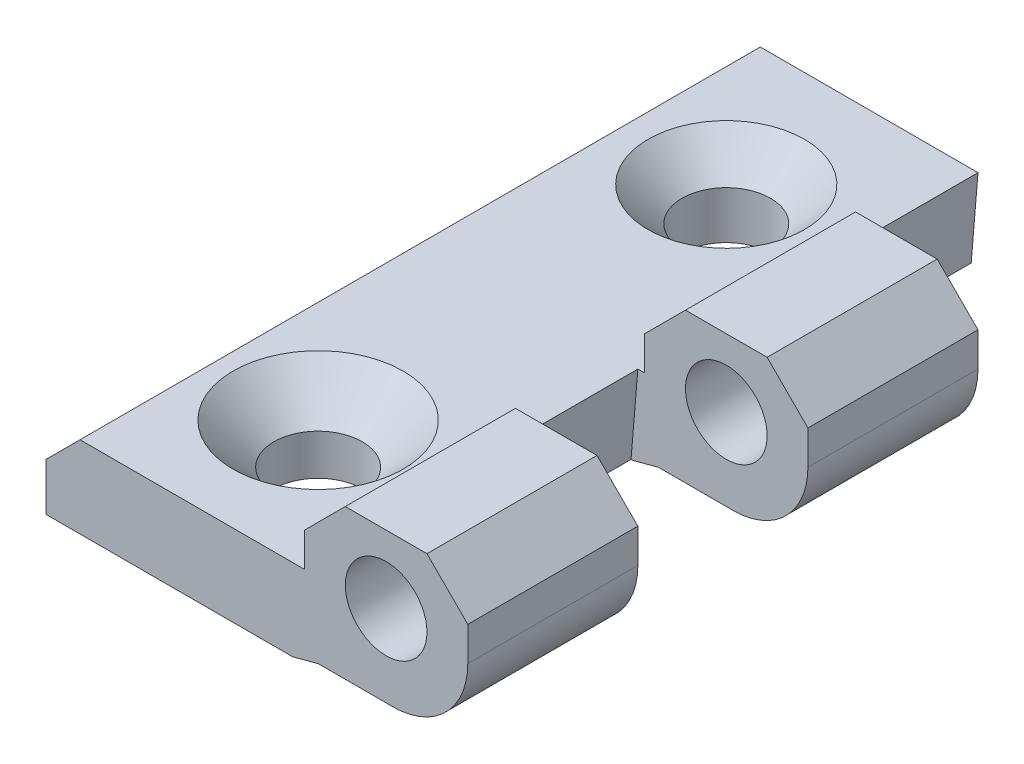
ISO-10303-21;
HEADER;
FILE_DESCRIPTION(('STEP AP214'),'2;1');
FILE_NAME('part.step','',(''),(''),'','','');
FILE_SCHEMA(('AUTOMOTIVE_DESIGN { 1 0 10303 214 1 1 1 1 }'));
ENDSEC;
DATA;
#1=APPLICATION_CONTEXT('core data for automotive mechanical design processes');
#2=APPLICATION_PROTOCOL_DEFINITION('international standard','automotive_design',2000,#1);
#3=PRODUCT_CONTEXT('',#1,'mechanical');
#4=PRODUCT('Part','Part','',(#3));
#5=PRODUCT_RELATED_PRODUCT_CATEGORY('part','',(#4));
#6=PRODUCT_DEFINITION_FORMATION('','',#4);
#7=PRODUCT_DEFINITION_CONTEXT('part definition',#1,'design');
#8=PRODUCT_DEFINITION('design','',#6,#7);
#9=PRODUCT_DEFINITION_SHAPE('','',#8);
#10=(LENGTH_UNIT() NAMED_UNIT(*) SI_UNIT(.MILLI.,.METRE.));
#11=(NAMED_UNIT(*) PLANE_ANGLE_UNIT() SI_UNIT($,.RADIAN.));
#12=(NAMED_UNIT(*) SI_UNIT($,.STERADIAN.) SOLID_ANGLE_UNIT());
#13=UNCERTAINTY_MEASURE_WITH_UNIT(LENGTH_MEASURE(1.E-05),#10,'distance_accuracy_value','');
#14=(GEOMETRIC_REPRESENTATION_CONTEXT(3) GLOBAL_UNCERTAINTY_ASSIGNED_CONTEXT((#13)) GLOBAL_UNIT_ASSIGNED_CONTEXT((#10,
#11,#12)) REPRESENTATION_CONTEXT('',''));
#15=CARTESIAN_POINT('',(0.,0.,0.));
#16=DIRECTION('',(0.,0.,1.));
#17=DIRECTION('',(1.,0.,0.));
#18=AXIS2_PLACEMENT_3D('',#15,#16,#17);
#19=CARTESIAN_POINT('',(-7.,0.,25.));
#20=DIRECTION('',(-0.99654575824488,0.0830454798537399,0.));
#21=DIRECTION('',(-0.0830454798537399,-0.99654575824488,0.));
#22=AXIS2_PLACEMENT_3D('',#19,#20,#21);
#23=PLANE('',#22);
#24=DIRECTION('',(0.08304547985374,0.99654575824488,0.));
#25=VECTOR('',#24,1.);
#26=CARTESIAN_POINT('',(-7.,0.,12.5));
#27=LINE('',#26,#25);
#28=CARTESIAN_POINT('',(-7.,0.,12.5));
#29=VERTEX_POINT('',#28);
#30=CARTESIAN_POINT('',(-6.5,6.,12.5));
#31=VERTEX_POINT('',#30);
#32=EDGE_CURVE('E199',#29,#31,#27,.T.);
#33=ORIENTED_EDGE('',*,*,#32,.F.);
#34=DIRECTION('',(0.,0.,-1.));
#35=VECTOR('',#34,1.);
#36=CARTESIAN_POINT('',(-7.,0.,12.5));
#37=LINE('',#36,#35);
#38=CARTESIAN_POINT('',(-7.,0.,0.));
#39=VERTEX_POINT('',#38);
#40=EDGE_CURVE('E187',#29,#39,#37,.T.);
#41=ORIENTED_EDGE('',*,*,#40,.T.);
#42=DIRECTION('',(0.08304547985374,0.99654575824488,0.));
#43=VECTOR('',#42,1.);
#44=CARTESIAN_POINT('',(-7.,0.,0.));
#45=LINE('',#44,#43);
#46=CARTESIAN_POINT('',(-6.5,6.,0.));
#47=VERTEX_POINT('',#46);
#48=EDGE_CURVE('E198',#39,#47,#45,.T.);
#49=ORIENTED_EDGE('',*,*,#48,.T.);
#50=DIRECTION('',(0.,0.,-1.));
#51=VECTOR('',#50,1.);
#52=CARTESIAN_POINT('',(-6.5,6.,12.5));
#53=LINE('',#52,#51);
#54=EDGE_CURVE('E212',#31,#47,#53,.T.);
#55=ORIENTED_EDGE('',*,*,#54,.F.);
#56=EDGE_LOOP('',(#33,#41,#49,#55));
#57=FACE_BOUND('',#56,.T.);
#58=ADVANCED_FACE('F16',(#57),#23,.F.);
#59=CARTESIAN_POINT('',(0.499999999999962,6.,12.5));
#60=DIRECTION('',(0.,0.,1.));
#61=DIRECTION('',(1.,0.,0.));
#62=AXIS2_PLACEMENT_3D('',#59,#60,#61);
#63=PLANE('',#62);
#64=CARTESIAN_POINT('',(0.,6.5,12.5));
#65=DIRECTION('',(0.,0.,1.));
#66=DIRECTION('',(1.,0.,0.));
#67=AXIS2_PLACEMENT_3D('',#64,#65,#66);
#68=CIRCLE('',#67,3.);
#69=CARTESIAN_POINT('',(3.,6.5,12.5));
#70=VERTEX_POINT('',#69);
#71=EDGE_CURVE('E209',#70,#70,#68,.T.);
#72=ORIENTED_EDGE('',*,*,#71,.T.);
#73=EDGE_LOOP('',(#72));
#74=FACE_BOUND('',#73,.T.);
#75=DIRECTION('',(1.,0.,0.));
#76=VECTOR('',#75,1.);
#77=CARTESIAN_POINT('',(-7.,0.,12.5));
#78=LINE('',#77,#76);
#79=CARTESIAN_POINT('',(-6.8660254037844,0.,12.5));
#80=VERTEX_POINT('',#79);
#81=EDGE_CURVE('E191',#29,#80,#78,.T.);
#82=ORIENTED_EDGE('',*,*,#81,.F.);
#83=ORIENTED_EDGE('',*,*,#32,.T.);
#84=DIRECTION('',(-1.,0.,0.));
#85=VECTOR('',#84,1.);
#86=CARTESIAN_POINT('',(-6.,6.,12.5));
#87=LINE('',#86,#85);
#88=CARTESIAN_POINT('',(-6.,6.,12.5));
#89=VERTEX_POINT('',#88);
#90=EDGE_CURVE('E208',#89,#31,#87,.T.);
#91=ORIENTED_EDGE('',*,*,#90,.F.);
#92=DIRECTION('',(0.,-1.,0.));
#93=VECTOR('',#92,1.);
#94=CARTESIAN_POINT('',(-6.,8.5,12.5));
#95=LINE('',#94,#93);
#96=CARTESIAN_POINT('',(-6.,8.5,12.5));
#97=VERTEX_POINT('',#96);
#98=EDGE_CURVE('E230',#97,#89,#95,.T.);
#99=ORIENTED_EDGE('',*,*,#98,.F.);
#100=DIRECTION('',(-0.707106781186548,-0.707106781186547,0.));
#101=VECTOR('',#100,1.);
#102=CARTESIAN_POINT('',(-3.,11.5,12.5));
#103=LINE('',#102,#101);
#104=CARTESIAN_POINT('',(-3.,11.5,12.5));
#105=VERTEX_POINT('',#104);
#106=EDGE_CURVE('E234',#105,#97,#103,.T.);
#107=ORIENTED_EDGE('',*,*,#106,.F.);
#108=DIRECTION('',(-1.,0.,0.));
#109=VECTOR('',#108,1.);
#110=CARTESIAN_POINT('',(3.,11.5,12.5));
#111=LINE('',#110,#109);
#112=CARTESIAN_POINT('',(3.,11.5,12.5));
#113=VERTEX_POINT('',#112);
#114=EDGE_CURVE('E238',#113,#105,#111,.T.);
#115=ORIENTED_EDGE('',*,*,#114,.F.);
#116=DIRECTION('',(-0.707106781186548,0.707106781186547,0.));
#117=VECTOR('',#116,1.);
#118=CARTESIAN_POINT('',(6.,8.5,12.5));
#119=LINE('',#118,#117);
#120=CARTESIAN_POINT('',(6.,8.5,12.5));
#121=VERTEX_POINT('',#120);
#122=EDGE_CURVE('E242',#121,#113,#119,.T.);
#123=ORIENTED_EDGE('',*,*,#122,.F.);
#124=DIRECTION('',(0.,1.,0.));
#125=VECTOR('',#124,1.);
#126=CARTESIAN_POINT('',(6.,6.,12.5));
#127=LINE('',#126,#125);
#128=CARTESIAN_POINT('',(6.,6.,12.5));
#129=VERTEX_POINT('',#128);
#130=EDGE_CURVE('E246',#129,#121,#127,.T.);
#131=ORIENTED_EDGE('',*,*,#130,.F.);
#132=CARTESIAN_POINT('',(0.499999999999962,6.,12.5));
#133=DIRECTION('',(0.,0.,1.));
#134=DIRECTION('',(0.,-1.,0.));
#135=AXIS2_PLACEMENT_3D('',#132,#133,#134);
#136=CIRCLE('',#135,5.5);
#137=CARTESIAN_POINT('',(0.5,0.5,12.5));
#138=VERTEX_POINT('',#137);
#139=EDGE_CURVE('E250',#138,#129,#136,.T.);
#140=ORIENTED_EDGE('',*,*,#139,.F.);
#141=DIRECTION('',(1.,0.,0.));
#142=VECTOR('',#141,1.);
#143=CARTESIAN_POINT('',(-5.,0.5,12.5));
#144=LINE('',#143,#142);
#145=CARTESIAN_POINT('',(-5.,0.5,12.5));
#146=VERTEX_POINT('',#145);
#147=EDGE_CURVE('E254',#146,#138,#144,.T.);
#148=ORIENTED_EDGE('',*,*,#147,.F.);
#149=DIRECTION('',(0.965925826289067,0.258819045102526,0.));
#150=VECTOR('',#149,1.);
#151=CARTESIAN_POINT('',(-6.8660254037844,0.,12.5));
#152=LINE('',#151,#150);
#153=EDGE_CURVE('E207',#80,#146,#152,.T.);
#154=ORIENTED_EDGE('',*,*,#153,.F.);
#155=EDGE_LOOP('',(#82,#83,#91,#99,#107,#115,#123,#131,#140,#148,#154));
#156=FACE_BOUND('',#155,.T.);
#157=ADVANCED_FACE('F204',(#74,#156),#63,.F.);
#158=CARTESIAN_POINT('',(-25.,0.,25.));
#159=DIRECTION('',(0.,1.,0.));
#160=DIRECTION('',(0.,0.,1.));
#161=AXIS2_PLACEMENT_3D('',#158,#159,#160);
#162=PLANE('',#161);
#163=CARTESIAN_POINT('',(-15.,0.,-15.));
#164=DIRECTION('',(0.,-1.,0.));
#165=DIRECTION('',(0.,0.,-1.));
#166=AXIS2_PLACEMENT_3D('',#163,#164,#165);
#167=CIRCLE('',#166,3.25);
#168=CARTESIAN_POINT('',(-15.,0.,-18.25));
#169=VERTEX_POINT('',#168);
#170=EDGE_CURVE('E261',#169,#169,#167,.T.);
#171=ORIENTED_EDGE('',*,*,#170,.F.);
#172=EDGE_LOOP('',(#171));
#173=FACE_BOUND('',#172,.T.);
#174=CARTESIAN_POINT('',(-15.,0.,15.));
#175=DIRECTION('',(0.,-1.,0.));
#176=DIRECTION('',(0.,0.,-1.));
#177=AXIS2_PLACEMENT_3D('',#174,#175,#176);
#178=CIRCLE('',#177,3.25);
#179=CARTESIAN_POINT('',(-15.,0.,11.75));
#180=VERTEX_POINT('',#179);
#181=EDGE_CURVE('E266',#180,#180,#178,.T.);
#182=ORIENTED_EDGE('',*,*,#181,.F.);
#183=EDGE_LOOP('',(#182));
#184=FACE_BOUND('',#183,.T.);
#185=DIRECTION('',(0.,0.,-1.));
#186=VECTOR('',#185,1.);
#187=CARTESIAN_POINT('',(-6.8660254037844,0.,25.));
#188=LINE('',#187,#186);
#189=CARTESIAN_POINT('',(-6.8660254037844,0.,25.));
#190=VERTEX_POINT('',#189);
#191=EDGE_CURVE('E269',#190,#80,#188,.T.);
#192=ORIENTED_EDGE('',*,*,#191,.F.);
#193=DIRECTION('',(1.,0.,0.));
#194=VECTOR('',#193,1.);
#195=CARTESIAN_POINT('',(-25.,0.,25.));
#196=LINE('',#195,#194);
#197=CARTESIAN_POINT('',(-25.,0.,25.));
#198=VERTEX_POINT('',#197);
#199=EDGE_CURVE('E271',#198,#190,#196,.T.);
#200=ORIENTED_EDGE('',*,*,#199,.F.);
#201=DIRECTION('',(0.,0.,-1.));
#202=VECTOR('',#201,1.);
#203=CARTESIAN_POINT('',(-25.,0.,25.));
#204=LINE('',#203,#202);
#205=CARTESIAN_POINT('',(-25.,0.,-25.));
#206=VERTEX_POINT('',#205);
#207=EDGE_CURVE('E275',#198,#206,#204,.T.);
#208=ORIENTED_EDGE('',*,*,#207,.T.);
#209=DIRECTION('',(1.,0.,0.));
#210=VECTOR('',#209,1.);
#211=CARTESIAN_POINT('',(-25.,0.,-25.));
#212=LINE('',#211,#210);
#213=CARTESIAN_POINT('',(-7.,0.,-25.));
#214=VERTEX_POINT('',#213);
#215=EDGE_CURVE('E280',#206,#214,#212,.T.);
#216=ORIENTED_EDGE('',*,*,#215,.T.);
#217=DIRECTION('',(0.,0.,-1.));
#218=VECTOR('',#217,1.);
#219=CARTESIAN_POINT('',(-7.,0.,-12.5));
#220=LINE('',#219,#218);
#221=CARTESIAN_POINT('',(-7.,0.,-12.5));
#222=VERTEX_POINT('',#221);
#223=EDGE_CURVE('E285',#222,#214,#220,.T.);
#224=ORIENTED_EDGE('',*,*,#223,.F.);
#225=DIRECTION('',(1.,0.,0.));
#226=VECTOR('',#225,1.);
#227=CARTESIAN_POINT('',(-7.,0.,-12.5));
#228=LINE('',#227,#226);
#229=CARTESIAN_POINT('',(-6.8660254037844,0.,-12.5));
#230=VERTEX_POINT('',#229);
#231=EDGE_CURVE('E289',#222,#230,#228,.T.);
#232=ORIENTED_EDGE('',*,*,#231,.T.);
#233=DIRECTION('',(0.,0.,1.));
#234=VECTOR('',#233,1.);
#235=CARTESIAN_POINT('',(-6.8660254037844,0.,-12.5));
#236=LINE('',#235,#234);
#237=CARTESIAN_POINT('',(-6.8660254037844,0.,0.));
#238=VERTEX_POINT('',#237);
#239=EDGE_CURVE('E294',#230,#238,#236,.T.);
#240=ORIENTED_EDGE('',*,*,#239,.T.);
#241=DIRECTION('',(1.,0.,0.));
#242=VECTOR('',#241,1.);
#243=CARTESIAN_POINT('',(-7.,0.,0.));
#244=LINE('',#243,#242);
#245=EDGE_CURVE('E194',#39,#238,#244,.T.);
#246=ORIENTED_EDGE('',*,*,#245,.F.);
#247=ORIENTED_EDGE('',*,*,#40,.F.);
#248=ORIENTED_EDGE('',*,*,#81,.T.);
#249=EDGE_LOOP('',(#192,#200,#208,#216,#224,#232,#240,#246,#247,#248));
#250=FACE_BOUND('',#249,.T.);
#251=ADVANCED_FACE('F190',(#173,#184,#250),#162,.F.);
#252=CARTESIAN_POINT('',(0.499999999999962,6.,0.));
#253=DIRECTION('',(0.,0.,1.));
#254=DIRECTION('',(1.,0.,0.));
#255=AXIS2_PLACEMENT_3D('',#252,#253,#254);
#256=PLANE('',#255);
#257=CARTESIAN_POINT('',(0.,6.5,0.));
#258=DIRECTION('',(0.,0.,1.));
#259=DIRECTION('',(1.,0.,0.));
#260=AXIS2_PLACEMENT_3D('',#257,#258,#259);
#261=CIRCLE('',#260,3.);
#262=CARTESIAN_POINT('',(3.,6.5,0.));
#263=VERTEX_POINT('',#262);
#264=EDGE_CURVE('E301',#263,#263,#261,.T.);
#265=ORIENTED_EDGE('',*,*,#264,.F.);
#266=EDGE_LOOP('',(#265));
#267=FACE_BOUND('',#266,.T.);
#268=ORIENTED_EDGE('',*,*,#48,.F.);
#269=ORIENTED_EDGE('',*,*,#245,.T.);
#270=DIRECTION('',(0.965925826289067,0.258819045102526,0.));
#271=VECTOR('',#270,1.);
#272=CARTESIAN_POINT('',(-6.8660254037844,0.,0.));
#273=LINE('',#272,#271);
#274=CARTESIAN_POINT('',(-5.,0.5,0.));
#275=VERTEX_POINT('',#274);
#276=EDGE_CURVE('E306',#238,#275,#273,.T.);
#277=ORIENTED_EDGE('',*,*,#276,.T.);
#278=DIRECTION('',(1.,0.,0.));
#279=VECTOR('',#278,1.);
#280=CARTESIAN_POINT('',(-5.,0.5,0.));
#281=LINE('',#280,#279);
#282=CARTESIAN_POINT('',(0.5,0.5,0.));
#283=VERTEX_POINT('',#282);
#284=EDGE_CURVE('E309',#275,#283,#281,.T.);
#285=ORIENTED_EDGE('',*,*,#284,.T.);
#286=CARTESIAN_POINT('',(0.499999999999962,6.,0.));
#287=DIRECTION('',(0.,0.,1.));
#288=DIRECTION('',(0.,-1.,0.));
#289=AXIS2_PLACEMENT_3D('',#286,#287,#288);
#290=CIRCLE('',#289,5.5);
#291=CARTESIAN_POINT('',(6.,6.,0.));
#292=VERTEX_POINT('',#291);
#293=EDGE_CURVE('E314',#283,#292,#290,.T.);
#294=ORIENTED_EDGE('',*,*,#293,.T.);
#295=DIRECTION('',(0.,1.,0.));
#296=VECTOR('',#295,1.);
#297=CARTESIAN_POINT('',(6.,6.,0.));
#298=LINE('',#297,#296);
#299=CARTESIAN_POINT('',(6.,8.5,0.));
#300=VERTEX_POINT('',#299);
#301=EDGE_CURVE('E319',#292,#300,#298,.T.);
#302=ORIENTED_EDGE('',*,*,#301,.T.);
#303=DIRECTION('',(-0.707106781186548,0.707106781186547,0.));
#304=VECTOR('',#303,1.);
#305=CARTESIAN_POINT('',(6.,8.5,0.));
#306=LINE('',#305,#304);
#307=CARTESIAN_POINT('',(3.,11.5,0.));
#308=VERTEX_POINT('',#307);
#309=EDGE_CURVE('E324',#300,#308,#306,.T.);
#310=ORIENTED_EDGE('',*,*,#309,.T.);
#311=DIRECTION('',(-1.,0.,0.));
#312=VECTOR('',#311,1.);
#313=CARTESIAN_POINT('',(3.,11.5,0.));
#314=LINE('',#313,#312);
#315=CARTESIAN_POINT('',(-3.,11.5,0.));
#316=VERTEX_POINT('',#315);
#317=EDGE_CURVE('E329',#308,#316,#314,.T.);
#318=ORIENTED_EDGE('',*,*,#317,.T.);
#319=DIRECTION('',(-0.707106781186548,-0.707106781186547,0.));
#320=VECTOR('',#319,1.);
#321=CARTESIAN_POINT('',(-3.,11.5,0.));
#322=LINE('',#321,#320);
#323=CARTESIAN_POINT('',(-6.,8.5,0.));
#324=VERTEX_POINT('',#323);
#325=EDGE_CURVE('E334',#316,#324,#322,.T.);
#326=ORIENTED_EDGE('',*,*,#325,.T.);
#327=DIRECTION('',(0.,-1.,0.));
#328=VECTOR('',#327,1.);
#329=CARTESIAN_POINT('',(-6.,8.5,0.));
#330=LINE('',#329,#328);
#331=CARTESIAN_POINT('',(-6.,6.,0.));
#332=VERTEX_POINT('',#331);
#333=EDGE_CURVE('E339',#324,#332,#330,.T.);
#334=ORIENTED_EDGE('',*,*,#333,.T.);
#335=DIRECTION('',(-1.,0.,0.));
#336=VECTOR('',#335,1.);
#337=CARTESIAN_POINT('',(-6.,6.,0.));
#338=LINE('',#337,#336);
#339=EDGE_CURVE('E344',#332,#47,#338,.T.);
#340=ORIENTED_EDGE('',*,*,#339,.T.);
#341=EDGE_LOOP('',(#268,#269,#277,#285,#294,#302,#310,#318,#326,#334,#340));
#342=FACE_BOUND('',#341,.T.);
#343=ADVANCED_FACE('F568',(#267,#342),#256,.T.);
#344=CARTESIAN_POINT('',(-6.5,6.,25.));
#345=DIRECTION('',(0.,-1.,0.));
#346=DIRECTION('',(0.,0.,-1.));
#347=AXIS2_PLACEMENT_3D('',#344,#345,#346);
#348=PLANE('',#347);
#349=CARTESIAN_POINT('',(-15.,6.,-15.));
#350=DIRECTION('',(0.,1.,0.));
#351=DIRECTION('',(0.,0.,-1.));
#352=AXIS2_PLACEMENT_3D('',#349,#350,#351);
#353=CIRCLE('',#352,5.75);
#354=CARTESIAN_POINT('',(-15.,6.,-20.75));
#355=VERTEX_POINT('',#354);
#356=EDGE_CURVE('E349',#355,#355,#353,.T.);
#357=ORIENTED_EDGE('',*,*,#356,.F.);
#358=EDGE_LOOP('',(#357));
#359=FACE_BOUND('',#358,.T.);
#360=CARTESIAN_POINT('',(-15.,6.,15.));
#361=DIRECTION('',(0.,-1.,0.));
#362=DIRECTION('',(0.,0.,-1.));
#363=AXIS2_PLACEMENT_3D('',#360,#361,#362);
#364=CIRCLE('',#363,6.25);
#365=CARTESIAN_POINT('',(-15.,6.,8.75));
#366=VERTEX_POINT('',#365);
#367=EDGE_CURVE('E354',#366,#366,#364,.T.);
#368=ORIENTED_EDGE('',*,*,#367,.T.);
#369=EDGE_LOOP('',(#368));
#370=FACE_BOUND('',#369,.T.);
#371=DIRECTION('',(0.,0.,-1.));
#372=VECTOR('',#371,1.);
#373=CARTESIAN_POINT('',(-22.5,6.,25.));
#374=LINE('',#373,#372);
#375=CARTESIAN_POINT('',(-22.5,6.,25.));
#376=VERTEX_POINT('',#375);
#377=CARTESIAN_POINT('',(-22.5,6.,-25.));
#378=VERTEX_POINT('',#377);
#379=EDGE_CURVE('E357',#376,#378,#374,.T.);
#380=ORIENTED_EDGE('',*,*,#379,.F.);
#381=DIRECTION('',(-1.,0.,0.));
#382=VECTOR('',#381,1.);
#383=CARTESIAN_POINT('',(-6.,6.,25.));
#384=LINE('',#383,#382);
#385=CARTESIAN_POINT('',(-6.,6.,25.));
#386=VERTEX_POINT('',#385);
#387=EDGE_CURVE('E359',#386,#376,#384,.T.);
#388=ORIENTED_EDGE('',*,*,#387,.F.);
#389=DIRECTION('',(0.,0.,-1.));
#390=VECTOR('',#389,1.);
#391=CARTESIAN_POINT('',(-6.,6.,25.));
#392=LINE('',#391,#390);
#393=EDGE_CURVE('E364',#386,#89,#392,.T.);
#394=ORIENTED_EDGE('',*,*,#393,.T.);
#395=ORIENTED_EDGE('',*,*,#90,.T.);
#396=ORIENTED_EDGE('',*,*,#54,.T.);
#397=ORIENTED_EDGE('',*,*,#339,.F.);
#398=DIRECTION('',(0.,0.,1.));
#399=VECTOR('',#398,1.);
#400=CARTESIAN_POINT('',(-6.,6.,-12.5));
#401=LINE('',#400,#399);
#402=CARTESIAN_POINT('',(-6.,6.,-12.5));
#403=VERTEX_POINT('',#402);
#404=EDGE_CURVE('E369',#403,#332,#401,.T.);
#405=ORIENTED_EDGE('',*,*,#404,.F.);
#406=DIRECTION('',(-1.,0.,0.));
#407=VECTOR('',#406,1.);
#408=CARTESIAN_POINT('',(-6.,6.,-12.5));
#409=LINE('',#408,#407);
#410=CARTESIAN_POINT('',(-6.5,6.,-12.5));
#411=VERTEX_POINT('',#410);
#412=EDGE_CURVE('E373',#403,#411,#409,.T.);
#413=ORIENTED_EDGE('',*,*,#412,.T.);
#414=DIRECTION('',(0.,0.,-1.));
#415=VECTOR('',#414,1.);
#416=CARTESIAN_POINT('',(-6.5,6.,-12.5));
#417=LINE('',#416,#415);
#418=CARTESIAN_POINT('',(-6.5,6.,-25.));
#419=VERTEX_POINT('',#418);
#420=EDGE_CURVE('E378',#411,#419,#417,.T.);
#421=ORIENTED_EDGE('',*,*,#420,.T.);
#422=DIRECTION('',(-1.,0.,0.));
#423=VECTOR('',#422,1.);
#424=CARTESIAN_POINT('',(-6.5,6.,-25.));
#425=LINE('',#424,#423);
#426=EDGE_CURVE('E383',#419,#378,#425,.T.);
#427=ORIENTED_EDGE('',*,*,#426,.T.);
#428=EDGE_LOOP('',(#380,#388,#394,#395,#396,#397,#405,#413,#421,#427));
#429=FACE_BOUND('',#428,.T.);
#430=ADVANCED_FACE('F595',(#359,#370,#429),#348,.F.);
#431=CARTESIAN_POINT('',(0.,6.5,25.));
#432=DIRECTION('',(0.,0.,-1.));
#433=DIRECTION('',(-1.,0.,0.));
#434=AXIS2_PLACEMENT_3D('',#431,#432,#433);
#435=CYLINDRICAL_SURFACE('',#434,3.);
#436=CARTESIAN_POINT('',(0.,6.5,25.));
#437=DIRECTION('',(0.,0.,1.));
#438=DIRECTION('',(1.,0.,0.));
#439=AXIS2_PLACEMENT_3D('',#436,#437,#438);
#440=CIRCLE('',#439,3.);
#441=CARTESIAN_POINT('',(3.,6.5,25.));
#442=VERTEX_POINT('',#441);
#443=EDGE_CURVE('E388',#442,#442,#440,.T.);
#444=ORIENTED_EDGE('',*,*,#443,.T.);
#445=EDGE_LOOP('',(#444));
#446=FACE_BOUND('',#445,.T.);
#447=ORIENTED_EDGE('',*,*,#71,.F.);
#448=EDGE_LOOP('',(#447));
#449=FACE_BOUND('',#448,.T.);
#450=ADVANCED_FACE('F709',(#446,#449),#435,.F.);
#451=CARTESIAN_POINT('',(-6.,8.5,25.));
#452=DIRECTION('',(1.,0.,0.));
#453=DIRECTION('',(0.,0.,-1.));
#454=AXIS2_PLACEMENT_3D('',#451,#452,#453);
#455=PLANE('',#454);
#456=ORIENTED_EDGE('',*,*,#98,.T.);
#457=ORIENTED_EDGE('',*,*,#393,.F.);
#458=DIRECTION('',(0.,-1.,0.));
#459=VECTOR('',#458,1.);
#460=CARTESIAN_POINT('',(-6.,8.5,25.));
#461=LINE('',#460,#459);
#462=CARTESIAN_POINT('',(-6.,8.5,25.));
#463=VERTEX_POINT('',#462);
#464=EDGE_CURVE('E393',#463,#386,#461,.T.);
#465=ORIENTED_EDGE('',*,*,#464,.F.);
#466=DIRECTION('',(0.,0.,-1.));
#467=VECTOR('',#466,1.);
#468=CARTESIAN_POINT('',(-6.,8.5,25.));
#469=LINE('',#468,#467);
#470=EDGE_CURVE('E395',#463,#97,#469,.T.);
#471=ORIENTED_EDGE('',*,*,#470,.T.);
#472=EDGE_LOOP('',(#456,#457,#465,#471));
#473=FACE_BOUND('',#472,.T.);
#474=ADVANCED_FACE('F609',(#473),#455,.F.);
#475=CARTESIAN_POINT('',(-3.,11.5,25.));
#476=DIRECTION('',(0.707106781186547,-0.707106781186548,0.));
#477=DIRECTION('',(0.707106781186548,0.707106781186547,0.));
#478=AXIS2_PLACEMENT_3D('',#475,#476,#477);
#479=PLANE('',#478);
#480=ORIENTED_EDGE('',*,*,#106,.T.);
#481=ORIENTED_EDGE('',*,*,#470,.F.);
#482=DIRECTION('',(-0.707106781186548,-0.707106781186547,0.));
#483=VECTOR('',#482,1.);
#484=CARTESIAN_POINT('',(-3.,11.5,25.));
#485=LINE('',#484,#483);
#486=CARTESIAN_POINT('',(-3.,11.5,25.));
#487=VERTEX_POINT('',#486);
#488=EDGE_CURVE('E400',#487,#463,#485,.T.);
#489=ORIENTED_EDGE('',*,*,#488,.F.);
#490=DIRECTION('',(0.,0.,-1.));
#491=VECTOR('',#490,1.);
#492=CARTESIAN_POINT('',(-3.,11.5,25.));
#493=LINE('',#492,#491);
#494=EDGE_CURVE('E404',#487,#105,#493,.T.);
#495=ORIENTED_EDGE('',*,*,#494,.T.);
#496=EDGE_LOOP('',(#480,#481,#489,#495));
#497=FACE_BOUND('',#496,.T.);
#498=ADVANCED_FACE('F614',(#497),#479,.F.);
#499=CARTESIAN_POINT('',(3.,11.5,25.));
#500=DIRECTION('',(0.,-1.,0.));
#501=DIRECTION('',(0.,0.,-1.));
#502=AXIS2_PLACEMENT_3D('',#499,#500,#501);
#503=PLANE('',#502);
#504=ORIENTED_EDGE('',*,*,#114,.T.);
#505=ORIENTED_EDGE('',*,*,#494,.F.);
#506=DIRECTION('',(-1.,0.,0.));
#507=VECTOR('',#506,1.);
#508=CARTESIAN_POINT('',(3.,11.5,25.));
#509=LINE('',#508,#507);
#510=CARTESIAN_POINT('',(3.,11.5,25.));
#511=VERTEX_POINT('',#510);
#512=EDGE_CURVE('E409',#511,#487,#509,.T.);
#513=ORIENTED_EDGE('',*,*,#512,.F.);
#514=DIRECTION('',(0.,0.,-1.));
#515=VECTOR('',#514,1.);
#516=CARTESIAN_POINT('',(3.,11.5,25.));
#517=LINE('',#516,#515);
#518=EDGE_CURVE('E413',#511,#113,#517,.T.);
#519=ORIENTED_EDGE('',*,*,#518,.T.);
#520=EDGE_LOOP('',(#504,#505,#513,#519));
#521=FACE_BOUND('',#520,.T.);
#522=ADVANCED_FACE('F618',(#521),#503,.F.);
#523=CARTESIAN_POINT('',(6.,8.5,25.));
#524=DIRECTION('',(-0.707106781186547,-0.707106781186548,0.));
#525=DIRECTION('',(0.707106781186548,-0.707106781186547,0.));
#526=AXIS2_PLACEMENT_3D('',#523,#524,#525);
#527=PLANE('',#526);
#528=ORIENTED_EDGE('',*,*,#122,.T.);
#529=ORIENTED_EDGE('',*,*,#518,.F.);
#530=DIRECTION('',(-0.707106781186548,0.707106781186547,0.));
#531=VECTOR('',#530,1.);
#532=CARTESIAN_POINT('',(6.,8.5,25.));
#533=LINE('',#532,#531);
#534=CARTESIAN_POINT('',(6.,8.5,25.));
#535=VERTEX_POINT('',#534);
#536=EDGE_CURVE('E418',#535,#511,#533,.T.);
#537=ORIENTED_EDGE('',*,*,#536,.F.);
#538=DIRECTION('',(0.,0.,-1.));
#539=VECTOR('',#538,1.);
#540=CARTESIAN_POINT('',(6.,8.5,25.));
#541=LINE('',#540,#539);
#542=EDGE_CURVE('E422',#535,#121,#541,.T.);
#543=ORIENTED_EDGE('',*,*,#542,.T.);
#544=EDGE_LOOP('',(#528,#529,#537,#543));
#545=FACE_BOUND('',#544,.T.);
#546=ADVANCED_FACE('F624',(#545),#527,.F.);
#547=CARTESIAN_POINT('',(6.,6.,25.));
#548=DIRECTION('',(-1.,0.,0.));
#549=DIRECTION('',(0.,0.,1.));
#550=AXIS2_PLACEMENT_3D('',#547,#548,#549);
#551=PLANE('',#550);
#552=ORIENTED_EDGE('',*,*,#130,.T.);
#553=ORIENTED_EDGE('',*,*,#542,.F.);
#554=DIRECTION('',(0.,1.,0.));
#555=VECTOR('',#554,1.);
#556=CARTESIAN_POINT('',(6.,6.,25.));
#557=LINE('',#556,#555);
#558=CARTESIAN_POINT('',(6.,6.,25.));
#559=VERTEX_POINT('',#558);
#560=EDGE_CURVE('E427',#559,#535,#557,.T.);
#561=ORIENTED_EDGE('',*,*,#560,.F.);
#562=DIRECTION('',(0.,0.,-1.));
#563=VECTOR('',#562,1.);
#564=CARTESIAN_POINT('',(6.,6.,25.));
#565=LINE('',#564,#563);
#566=EDGE_CURVE('E431',#559,#129,#565,.T.);
#567=ORIENTED_EDGE('',*,*,#566,.T.);
#568=EDGE_LOOP('',(#552,#553,#561,#567));
#569=FACE_BOUND('',#568,.T.);
#570=ADVANCED_FACE('F629',(#569),#551,.F.);
#571=CARTESIAN_POINT('',(0.499999999999962,6.,25.));
#572=DIRECTION('',(0.,0.,-1.));
#573=DIRECTION('',(-1.,0.,0.));
#574=AXIS2_PLACEMENT_3D('',#571,#572,#573);
#575=CYLINDRICAL_SURFACE('',#574,5.5);
#576=ORIENTED_EDGE('',*,*,#139,.T.);
#577=ORIENTED_EDGE('',*,*,#566,.F.);
#578=CARTESIAN_POINT('',(0.499999999999962,6.,25.));
#579=DIRECTION('',(0.,0.,1.));
#580=DIRECTION('',(0.,-1.,0.));
#581=AXIS2_PLACEMENT_3D('',#578,#579,#580);
#582=CIRCLE('',#581,5.5);
#583=CARTESIAN_POINT('',(0.5,0.5,25.));
#584=VERTEX_POINT('',#583);
#585=EDGE_CURVE('E436',#584,#559,#582,.T.);
#586=ORIENTED_EDGE('',*,*,#585,.F.);
#587=DIRECTION('',(0.,0.,-1.));
#588=VECTOR('',#587,1.);
#589=CARTESIAN_POINT('',(0.5,0.5,25.));
#590=LINE('',#589,#588);
#591=EDGE_CURVE('E440',#584,#138,#590,.T.);
#592=ORIENTED_EDGE('',*,*,#591,.T.);
#593=EDGE_LOOP('',(#576,#577,#586,#592));
#594=FACE_BOUND('',#593,.T.);
#595=ADVANCED_FACE('F633',(#594),#575,.T.);
#596=CARTESIAN_POINT('',(-5.,0.5,25.));
#597=DIRECTION('',(0.,1.,0.));
#598=DIRECTION('',(0.,0.,1.));
#599=AXIS2_PLACEMENT_3D('',#596,#597,#598);
#600=PLANE('',#599);
#601=ORIENTED_EDGE('',*,*,#147,.T.);
#602=ORIENTED_EDGE('',*,*,#591,.F.);
#603=DIRECTION('',(1.,0.,0.));
#604=VECTOR('',#603,1.);
#605=CARTESIAN_POINT('',(-5.,0.5,25.));
#606=LINE('',#605,#604);
#607=CARTESIAN_POINT('',(-5.,0.5,25.));
#608=VERTEX_POINT('',#607);
#609=EDGE_CURVE('E445',#608,#584,#606,.T.);
#610=ORIENTED_EDGE('',*,*,#609,.F.);
#611=DIRECTION('',(0.,0.,-1.));
#612=VECTOR('',#611,1.);
#613=CARTESIAN_POINT('',(-5.,0.5,25.));
#614=LINE('',#613,#612);
#615=EDGE_CURVE('E449',#608,#146,#614,.T.);
#616=ORIENTED_EDGE('',*,*,#615,.T.);
#617=EDGE_LOOP('',(#601,#602,#610,#616));
#618=FACE_BOUND('',#617,.T.);
#619=ADVANCED_FACE('F636',(#618),#600,.F.);
#620=CARTESIAN_POINT('',(-6.8660254037844,0.,25.));
#621=DIRECTION('',(-0.258819045102526,0.965925826289067,0.));
#622=DIRECTION('',(-0.965925826289067,-0.258819045102526,0.));
#623=AXIS2_PLACEMENT_3D('',#620,#621,#622);
#624=PLANE('',#623);
#625=ORIENTED_EDGE('',*,*,#153,.T.);
#626=ORIENTED_EDGE('',*,*,#615,.F.);
#627=DIRECTION('',(0.965925826289067,0.258819045102526,0.));
#628=VECTOR('',#627,1.);
#629=CARTESIAN_POINT('',(-6.8660254037844,0.,25.));
#630=LINE('',#629,#628);
#631=EDGE_CURVE('E454',#190,#608,#630,.T.);
#632=ORIENTED_EDGE('',*,*,#631,.F.);
#633=ORIENTED_EDGE('',*,*,#191,.T.);
#634=EDGE_LOOP('',(#625,#626,#632,#633));
#635=FACE_BOUND('',#634,.T.);
#636=ADVANCED_FACE('F641',(#635),#624,.F.);
#637=CARTESIAN_POINT('',(-15.,0.,-15.));
#638=DIRECTION('',(0.,-1.,0.));
#639=DIRECTION('',(0.,0.,-1.));
#640=AXIS2_PLACEMENT_3D('',#637,#638,#639);
#641=CYLINDRICAL_SURFACE('',#640,3.25);
#642=ORIENTED_EDGE('',*,*,#170,.T.);
#643=EDGE_LOOP('',(#642));
#644=FACE_BOUND('',#643,.T.);
#645=CARTESIAN_POINT('',(-15.,3.5,-15.));
#646=DIRECTION('',(0.,-1.,0.));
#647=DIRECTION('',(0.,0.,-1.));
#648=AXIS2_PLACEMENT_3D('',#645,#646,#647);
#649=CIRCLE('',#648,3.25);
#650=CARTESIAN_POINT('',(-15.,3.5,-18.25));
#651=VERTEX_POINT('',#650);
#652=EDGE_CURVE('E458',#651,#651,#649,.T.);
#653=ORIENTED_EDGE('',*,*,#652,.F.);
#654=EDGE_LOOP('',(#653));
#655=FACE_BOUND('',#654,.T.);
#656=ADVANCED_FACE('F739',(#644,#655),#641,.F.);
#657=CARTESIAN_POINT('',(-15.,0.,15.));
#658=DIRECTION('',(0.,-1.,0.));
#659=DIRECTION('',(0.,0.,-1.));
#660=AXIS2_PLACEMENT_3D('',#657,#658,#659);
#661=CYLINDRICAL_SURFACE('',#660,3.25);
#662=ORIENTED_EDGE('',*,*,#181,.T.);
#663=EDGE_LOOP('',(#662));
#664=FACE_BOUND('',#663,.T.);
#665=CARTESIAN_POINT('',(-15.,3.,15.));
#666=DIRECTION('',(0.,-1.,0.));
#667=DIRECTION('',(0.,0.,-1.));
#668=AXIS2_PLACEMENT_3D('',#665,#666,#667);
#669=CIRCLE('',#668,3.25);
#670=CARTESIAN_POINT('',(-15.,3.,11.75));
#671=VERTEX_POINT('',#670);
#672=EDGE_CURVE('E463',#671,#671,#669,.T.);
#673=ORIENTED_EDGE('',*,*,#672,.F.);
#674=EDGE_LOOP('',(#673));
#675=FACE_BOUND('',#674,.T.);
#676=ADVANCED_FACE('F742',(#664,#675),#661,.F.);
#677=CARTESIAN_POINT('',(0.,0.,25.));
#678=DIRECTION('',(0.,0.,1.));
#679=DIRECTION('',(1.,0.,0.));
#680=AXIS2_PLACEMENT_3D('',#677,#678,#679);
#681=PLANE('',#680);
#682=ORIENTED_EDGE('',*,*,#387,.T.);
#683=DIRECTION('',(-0.707106781186548,-0.707106781186547,0.));
#684=VECTOR('',#683,1.);
#685=CARTESIAN_POINT('',(-22.5,6.,25.));
#686=LINE('',#685,#684);
#687=CARTESIAN_POINT('',(-25.,3.5,25.));
#688=VERTEX_POINT('',#687);
#689=EDGE_CURVE('E466',#376,#688,#686,.T.);
#690=ORIENTED_EDGE('',*,*,#689,.T.);
#691=DIRECTION('',(0.,-1.,0.));
#692=VECTOR('',#691,1.);
#693=CARTESIAN_POINT('',(-25.,3.5,25.));
#694=LINE('',#693,#692);
#695=EDGE_CURVE('E469',#688,#198,#694,.T.);
#696=ORIENTED_EDGE('',*,*,#695,.T.);
#697=ORIENTED_EDGE('',*,*,#199,.T.);
#698=ORIENTED_EDGE('',*,*,#631,.T.);
#699=ORIENTED_EDGE('',*,*,#609,.T.);
#700=ORIENTED_EDGE('',*,*,#585,.T.);
#701=ORIENTED_EDGE('',*,*,#560,.T.);
#702=ORIENTED_EDGE('',*,*,#536,.T.);
#703=ORIENTED_EDGE('',*,*,#512,.T.);
#704=ORIENTED_EDGE('',*,*,#488,.T.);
#705=ORIENTED_EDGE('',*,*,#464,.T.);
#706=EDGE_LOOP('',(#682,#690,#696,#697,#698,#699,#700,#701,#702,#703,#704,#705));
#707=FACE_BOUND('',#706,.T.);
#708=ORIENTED_EDGE('',*,*,#443,.F.);
#709=EDGE_LOOP('',(#708));
#710=FACE_BOUND('',#709,.T.);
#711=ADVANCED_FACE('F644',(#707,#710),#681,.T.);
#712=CARTESIAN_POINT('',(-25.,3.5,25.));
#713=DIRECTION('',(1.,0.,0.));
#714=DIRECTION('',(0.,0.,-1.));
#715=AXIS2_PLACEMENT_3D('',#712,#713,#714);
#716=PLANE('',#715);
#717=DIRECTION('',(0.,-1.,0.));
#718=VECTOR('',#717,1.);
#719=CARTESIAN_POINT('',(-25.,3.5,-25.));
#720=LINE('',#719,#718);
#721=CARTESIAN_POINT('',(-25.,3.5,-25.));
#722=VERTEX_POINT('',#721);
#723=EDGE_CURVE('E474',#722,#206,#720,.T.);
#724=ORIENTED_EDGE('',*,*,#723,.T.);
#725=ORIENTED_EDGE('',*,*,#207,.F.);
#726=ORIENTED_EDGE('',*,*,#695,.F.);
#727=DIRECTION('',(0.,0.,-1.));
#728=VECTOR('',#727,1.);
#729=CARTESIAN_POINT('',(-25.,3.5,25.));
#730=LINE('',#729,#728);
#731=EDGE_CURVE('E479',#688,#722,#730,.T.);
#732=ORIENTED_EDGE('',*,*,#731,.T.);
#733=EDGE_LOOP('',(#724,#725,#726,#732));
#734=FACE_BOUND('',#733,.T.);
#735=ADVANCED_FACE('F648',(#734),#716,.F.);
#736=CARTESIAN_POINT('',(0.,0.,-25.));
#737=DIRECTION('',(0.,0.,1.));
#738=DIRECTION('',(1.,0.,0.));
#739=AXIS2_PLACEMENT_3D('',#736,#737,#738);
#740=PLANE('',#739);
#741=DIRECTION('',(-0.707106781186548,-0.707106781186547,0.));
#742=VECTOR('',#741,1.);
#743=CARTESIAN_POINT('',(-22.5,6.,-25.));
#744=LINE('',#743,#742);
#745=EDGE_CURVE('E484',#378,#722,#744,.T.);
#746=ORIENTED_EDGE('',*,*,#745,.F.);
#747=ORIENTED_EDGE('',*,*,#426,.F.);
#748=DIRECTION('',(0.08304547985374,0.99654575824488,0.));
#749=VECTOR('',#748,1.);
#750=CARTESIAN_POINT('',(-7.,0.,-25.));
#751=LINE('',#750,#749);
#752=EDGE_CURVE('E488',#214,#419,#751,.T.);
#753=ORIENTED_EDGE('',*,*,#752,.F.);
#754=ORIENTED_EDGE('',*,*,#215,.F.);
#755=ORIENTED_EDGE('',*,*,#723,.F.);
#756=EDGE_LOOP('',(#746,#747,#753,#754,#755));
#757=FACE_BOUND('',#756,.T.);
#758=ADVANCED_FACE('F591',(#757),#740,.F.);
#759=DIRECTION('',(0.08304547985374,0.99654575824488,0.));
#760=VECTOR('',#759,1.);
#761=CARTESIAN_POINT('',(-7.,0.,-12.5));
#762=LINE('',#761,#760);
#763=EDGE_CURVE('E492',#222,#411,#762,.T.);
#764=ORIENTED_EDGE('',*,*,#763,.F.);
#765=ORIENTED_EDGE('',*,*,#223,.T.);
#766=ORIENTED_EDGE('',*,*,#752,.T.);
#767=ORIENTED_EDGE('',*,*,#420,.F.);
#768=EDGE_LOOP('',(#764,#765,#766,#767));
#769=FACE_BOUND('',#768,.T.);
#770=ADVANCED_FACE('F586',(#769),#23,.F.);
#771=CARTESIAN_POINT('',(0.499999999999962,6.,-12.5));
#772=DIRECTION('',(0.,0.,1.));
#773=DIRECTION('',(1.,0.,0.));
#774=AXIS2_PLACEMENT_3D('',#771,#772,#773);
#775=PLANE('',#774);
#776=CARTESIAN_POINT('',(0.,6.5,-12.5));
#777=DIRECTION('',(0.,0.,1.));
#778=DIRECTION('',(1.,0.,0.));
#779=AXIS2_PLACEMENT_3D('',#776,#777,#778);
#780=CIRCLE('',#779,3.);
#781=CARTESIAN_POINT('',(3.,6.5,-12.5));
#782=VERTEX_POINT('',#781);
#783=EDGE_CURVE('E496',#782,#782,#780,.T.);
#784=ORIENTED_EDGE('',*,*,#783,.T.);
#785=EDGE_LOOP('',(#784));
#786=FACE_BOUND('',#785,.T.);
#787=ORIENTED_EDGE('',*,*,#231,.F.);
#788=ORIENTED_EDGE('',*,*,#763,.T.);
#789=ORIENTED_EDGE('',*,*,#412,.F.);
#790=DIRECTION('',(0.,-1.,0.));
#791=VECTOR('',#790,1.);
#792=CARTESIAN_POINT('',(-6.,8.5,-12.5));
#793=LINE('',#792,#791);
#794=CARTESIAN_POINT('',(-6.,8.5,-12.5));
#795=VERTEX_POINT('',#794);
#796=EDGE_CURVE('E501',#795,#403,#793,.T.);
#797=ORIENTED_EDGE('',*,*,#796,.F.);
#798=DIRECTION('',(-0.707106781186548,-0.707106781186547,0.));
#799=VECTOR('',#798,1.);
#800=CARTESIAN_POINT('',(-3.,11.5,-12.5));
#801=LINE('',#800,#799);
#802=CARTESIAN_POINT('',(-3.,11.5,-12.5));
#803=VERTEX_POINT('',#802);
#804=EDGE_CURVE('E503',#803,#795,#801,.T.);
#805=ORIENTED_EDGE('',*,*,#804,.F.);
#806=DIRECTION('',(-1.,0.,0.));
#807=VECTOR('',#806,1.);
#808=CARTESIAN_POINT('',(3.,11.5,-12.5));
#809=LINE('',#808,#807);
#810=CARTESIAN_POINT('',(3.,11.5,-12.5));
#811=VERTEX_POINT('',#810);
#812=EDGE_CURVE('E508',#811,#803,#809,.T.);
#813=ORIENTED_EDGE('',*,*,#812,.F.);
#814=DIRECTION('',(-0.707106781186548,0.707106781186547,0.));
#815=VECTOR('',#814,1.);
#816=CARTESIAN_POINT('',(6.,8.5,-12.5));
#817=LINE('',#816,#815);
#818=CARTESIAN_POINT('',(6.,8.5,-12.5));
#819=VERTEX_POINT('',#818);
#820=EDGE_CURVE('E513',#819,#811,#817,.T.);
#821=ORIENTED_EDGE('',*,*,#820,.F.);
#822=DIRECTION('',(0.,1.,0.));
#823=VECTOR('',#822,1.);
#824=CARTESIAN_POINT('',(6.,6.,-12.5));
#825=LINE('',#824,#823);
#826=CARTESIAN_POINT('',(6.,6.,-12.5));
#827=VERTEX_POINT('',#826);
#828=EDGE_CURVE('E518',#827,#819,#825,.T.);
#829=ORIENTED_EDGE('',*,*,#828,.F.);
#830=CARTESIAN_POINT('',(0.499999999999962,6.,-12.5));
#831=DIRECTION('',(0.,0.,1.));
#832=DIRECTION('',(0.,-1.,0.));
#833=AXIS2_PLACEMENT_3D('',#830,#831,#832);
#834=CIRCLE('',#833,5.5);
#835=CARTESIAN_POINT('',(0.5,0.5,-12.5));
#836=VERTEX_POINT('',#835);
#837=EDGE_CURVE('E523',#836,#827,#834,.T.);
#838=ORIENTED_EDGE('',*,*,#837,.F.);
#839=DIRECTION('',(1.,0.,0.));
#840=VECTOR('',#839,1.);
#841=CARTESIAN_POINT('',(-5.,0.5,-12.5));
#842=LINE('',#841,#840);
#843=CARTESIAN_POINT('',(-5.,0.5,-12.5));
#844=VERTEX_POINT('',#843);
#845=EDGE_CURVE('E527',#844,#836,#842,.T.);
#846=ORIENTED_EDGE('',*,*,#845,.F.);
#847=DIRECTION('',(0.965925826289067,0.258819045102526,0.));
#848=VECTOR('',#847,1.);
#849=CARTESIAN_POINT('',(-6.8660254037844,0.,-12.5));
#850=LINE('',#849,#848);
#851=EDGE_CURVE('E531',#230,#844,#850,.T.);
#852=ORIENTED_EDGE('',*,*,#851,.F.);
#853=EDGE_LOOP('',(#787,#788,#789,#797,#805,#813,#821,#829,#838,#846,#852));
#854=FACE_BOUND('',#853,.T.);
#855=ADVANCED_FACE('F576',(#786,#854),#775,.F.);
#856=CARTESIAN_POINT('',(-6.8660254037844,0.,-12.5));
#857=DIRECTION('',(0.258819045102526,-0.965925826289067,0.));
#858=DIRECTION('',(0.965925826289067,0.258819045102526,0.));
#859=AXIS2_PLACEMENT_3D('',#856,#857,#858);
#860=PLANE('',#859);
#861=ORIENTED_EDGE('',*,*,#276,.F.);
#862=ORIENTED_EDGE('',*,*,#239,.F.);
#863=ORIENTED_EDGE('',*,*,#851,.T.);
#864=DIRECTION('',(0.,0.,1.));
#865=VECTOR('',#864,1.);
#866=CARTESIAN_POINT('',(-5.,0.5,-12.5));
#867=LINE('',#866,#865);
#868=EDGE_CURVE('E32',#844,#275,#867,.T.);
#869=ORIENTED_EDGE('',*,*,#868,.T.);
#870=EDGE_LOOP('',(#861,#862,#863,#869));
#871=FACE_BOUND('',#870,.T.);
#872=ADVANCED_FACE('F580',(#871),#860,.T.);
#873=CARTESIAN_POINT('',(0.,6.5,-12.5));
#874=DIRECTION('',(0.,0.,1.));
#875=DIRECTION('',(1.,0.,0.));
#876=AXIS2_PLACEMENT_3D('',#873,#874,#875);
#877=CYLINDRICAL_SURFACE('',#876,3.);
#878=ORIENTED_EDGE('',*,*,#783,.F.);
#879=EDGE_LOOP('',(#878));
#880=FACE_BOUND('',#879,.T.);
#881=ORIENTED_EDGE('',*,*,#264,.T.);
#882=EDGE_LOOP('',(#881));
#883=FACE_BOUND('',#882,.T.);
#884=ADVANCED_FACE('F681',(#880,#883),#877,.F.);
#885=CARTESIAN_POINT('',(-5.,0.5,-12.5));
#886=DIRECTION('',(0.,-1.,0.));
#887=DIRECTION('',(0.,0.,-1.));
#888=AXIS2_PLACEMENT_3D('',#885,#886,#887);
#889=PLANE('',#888);
#890=ORIENTED_EDGE('',*,*,#284,.F.);
#891=ORIENTED_EDGE('',*,*,#868,.F.);
#892=ORIENTED_EDGE('',*,*,#845,.T.);
#893=DIRECTION('',(0.,0.,1.));
#894=VECTOR('',#893,1.);
#895=CARTESIAN_POINT('',(0.5,0.5,-12.5));
#896=LINE('',#895,#894);
#897=EDGE_CURVE('E40',#836,#283,#896,.T.);
#898=ORIENTED_EDGE('',*,*,#897,.T.);
#899=EDGE_LOOP('',(#890,#891,#892,#898));
#900=FACE_BOUND('',#899,.T.);
#901=ADVANCED_FACE('F578',(#900),#889,.T.);
#902=CARTESIAN_POINT('',(0.499999999999962,6.,-12.5));
#903=DIRECTION('',(0.,0.,1.));
#904=DIRECTION('',(1.,0.,0.));
#905=AXIS2_PLACEMENT_3D('',#902,#903,#904);
#906=CYLINDRICAL_SURFACE('',#905,5.5);
#907=ORIENTED_EDGE('',*,*,#293,.F.);
#908=ORIENTED_EDGE('',*,*,#897,.F.);
#909=ORIENTED_EDGE('',*,*,#837,.T.);
#910=DIRECTION('',(0.,0.,1.));
#911=VECTOR('',#910,1.);
#912=CARTESIAN_POINT('',(6.,6.,-12.5));
#913=LINE('',#912,#911);
#914=EDGE_CURVE('E542',#827,#292,#913,.T.);
#915=ORIENTED_EDGE('',*,*,#914,.T.);
#916=EDGE_LOOP('',(#907,#908,#909,#915));
#917=FACE_BOUND('',#916,.T.);
#918=ADVANCED_FACE('F577',(#917),#906,.T.);
#919=CARTESIAN_POINT('',(6.,6.,-12.5));
#920=DIRECTION('',(1.,0.,0.));
#921=DIRECTION('',(0.,0.,-1.));
#922=AXIS2_PLACEMENT_3D('',#919,#920,#921);
#923=PLANE('',#922);
#924=ORIENTED_EDGE('',*,*,#301,.F.);
#925=ORIENTED_EDGE('',*,*,#914,.F.);
#926=ORIENTED_EDGE('',*,*,#828,.T.);
#927=DIRECTION('',(0.,0.,1.));
#928=VECTOR('',#927,1.);
#929=CARTESIAN_POINT('',(6.,8.5,-12.5));
#930=LINE('',#929,#928);
#931=EDGE_CURVE('E547',#819,#300,#930,.T.);
#932=ORIENTED_EDGE('',*,*,#931,.T.);
#933=EDGE_LOOP('',(#924,#925,#926,#932));
#934=FACE_BOUND('',#933,.T.);
#935=ADVANCED_FACE('F573',(#934),#923,.T.);
#936=CARTESIAN_POINT('',(6.,8.5,-12.5));
#937=DIRECTION('',(0.707106781186547,0.707106781186548,0.));
#938=DIRECTION('',(-0.707106781186548,0.707106781186547,0.));
#939=AXIS2_PLACEMENT_3D('',#936,#937,#938);
#940=PLANE('',#939);
#941=ORIENTED_EDGE('',*,*,#309,.F.);
#942=ORIENTED_EDGE('',*,*,#931,.F.);
#943=ORIENTED_EDGE('',*,*,#820,.T.);
#944=DIRECTION('',(0.,0.,1.));
#945=VECTOR('',#944,1.);
#946=CARTESIAN_POINT('',(3.,11.5,-12.5));
#947=LINE('',#946,#945);
#948=EDGE_CURVE('E552',#811,#308,#947,.T.);
#949=ORIENTED_EDGE('',*,*,#948,.T.);
#950=EDGE_LOOP('',(#941,#942,#943,#949));
#951=FACE_BOUND('',#950,.T.);
#952=ADVANCED_FACE('F570',(#951),#940,.T.);
#953=CARTESIAN_POINT('',(3.,11.5,-12.5));
#954=DIRECTION('',(0.,1.,0.));
#955=DIRECTION('',(0.,0.,1.));
#956=AXIS2_PLACEMENT_3D('',#953,#954,#955);
#957=PLANE('',#956);
#958=ORIENTED_EDGE('',*,*,#317,.F.);
#959=ORIENTED_EDGE('',*,*,#948,.F.);
#960=ORIENTED_EDGE('',*,*,#812,.T.);
#961=DIRECTION('',(0.,0.,1.));
#962=VECTOR('',#961,1.);
#963=CARTESIAN_POINT('',(-3.,11.5,-12.5));
#964=LINE('',#963,#962);
#965=EDGE_CURVE('E25',#803,#316,#964,.T.);
#966=ORIENTED_EDGE('',*,*,#965,.T.);
#967=EDGE_LOOP('',(#958,#959,#960,#966));
#968=FACE_BOUND('',#967,.T.);
#969=ADVANCED_FACE('F563',(#968),#957,.T.);
#970=CARTESIAN_POINT('',(-3.,11.5,-12.5));
#971=DIRECTION('',(-0.707106781186547,0.707106781186548,0.));
#972=DIRECTION('',(-0.707106781186548,-0.707106781186547,0.));
#973=AXIS2_PLACEMENT_3D('',#970,#971,#972);
#974=PLANE('',#973);
#975=ORIENTED_EDGE('',*,*,#325,.F.);
#976=ORIENTED_EDGE('',*,*,#965,.F.);
#977=ORIENTED_EDGE('',*,*,#804,.T.);
#978=DIRECTION('',(0.,0.,1.));
#979=VECTOR('',#978,1.);
#980=CARTESIAN_POINT('',(-6.,8.5,-12.5));
#981=LINE('',#980,#979);
#982=EDGE_CURVE('E11',#795,#324,#981,.T.);
#983=ORIENTED_EDGE('',*,*,#982,.T.);
#984=EDGE_LOOP('',(#975,#976,#977,#983));
#985=FACE_BOUND('',#984,.T.);
#986=ADVANCED_FACE('F602',(#985),#974,.T.);
#987=CARTESIAN_POINT('',(-6.,8.5,-12.5));
#988=DIRECTION('',(-1.,0.,0.));
#989=DIRECTION('',(0.,0.,1.));
#990=AXIS2_PLACEMENT_3D('',#987,#988,#989);
#991=PLANE('',#990);
#992=ORIENTED_EDGE('',*,*,#333,.F.);
#993=ORIENTED_EDGE('',*,*,#982,.F.);
#994=ORIENTED_EDGE('',*,*,#796,.T.);
#995=ORIENTED_EDGE('',*,*,#404,.T.);
#996=EDGE_LOOP('',(#992,#993,#994,#995));
#997=FACE_BOUND('',#996,.T.);
#998=ADVANCED_FACE('F603',(#997),#991,.T.);
#999=CARTESIAN_POINT('',(-15.,6.5,-15.));
#1000=DIRECTION('',(0.,1.,0.));
#1001=DIRECTION('',(0.,0.,1.));
#1002=AXIS2_PLACEMENT_3D('',#999,#1000,#1001);
#1003=CONICAL_SURFACE('',#1002,6.25,0.785398163397449);
#1004=ORIENTED_EDGE('',*,*,#652,.T.);
#1005=EDGE_LOOP('',(#1004));
#1006=FACE_BOUND('',#1005,.T.);
#1007=ORIENTED_EDGE('',*,*,#356,.T.);
#1008=EDGE_LOOP('',(#1007));
#1009=FACE_BOUND('',#1008,.T.);
#1010=ADVANCED_FACE('F656',(#1006,#1009),#1003,.F.);
#1011=CARTESIAN_POINT('',(-15.,6.,15.));
#1012=DIRECTION('',(0.,1.,0.));
#1013=DIRECTION('',(0.,0.,1.));
#1014=AXIS2_PLACEMENT_3D('',#1011,#1012,#1013);
#1015=CONICAL_SURFACE('',#1014,6.25,0.785398163397448);
#1016=ORIENTED_EDGE('',*,*,#672,.T.);
#1017=EDGE_LOOP('',(#1016));
#1018=FACE_BOUND('',#1017,.T.);
#1019=ORIENTED_EDGE('',*,*,#367,.F.);
#1020=EDGE_LOOP('',(#1019));
#1021=FACE_BOUND('',#1020,.T.);
#1022=ADVANCED_FACE('F651',(#1018,#1021),#1015,.F.);
#1023=CARTESIAN_POINT('',(-22.5,6.,25.));
#1024=DIRECTION('',(0.707106781186547,-0.707106781186548,0.));
#1025=DIRECTION('',(0.707106781186548,0.707106781186547,0.));
#1026=AXIS2_PLACEMENT_3D('',#1023,#1024,#1025);
#1027=PLANE('',#1026);
#1028=ORIENTED_EDGE('',*,*,#745,.T.);
#1029=ORIENTED_EDGE('',*,*,#731,.F.);
#1030=ORIENTED_EDGE('',*,*,#689,.F.);
#1031=ORIENTED_EDGE('',*,*,#379,.T.);
#1032=EDGE_LOOP('',(#1028,#1029,#1030,#1031));
#1033=FACE_BOUND('',#1032,.T.);
#1034=ADVANCED_FACE('F18',(#1033),#1027,.F.);
#1035=CLOSED_SHELL('',(#58,#157,#251,#343,#430,#450,#474,#498,#522,#546,#570,#595,#619,#636,
#656,#676,#711,#735,#758,#770,#855,#872,#884,#901,#918,#935,#952,#969,#986,#998,#1010,#1022,#1034));
#1036=MANIFOLD_SOLID_BREP('B1',#1035);
#1037=ADVANCED_BREP_SHAPE_REPRESENTATION('',(#18,#1036),#14);
#1038=SHAPE_DEFINITION_REPRESENTATION(#9,#1037);
ENDSEC;
END-ISO-10303-21;
